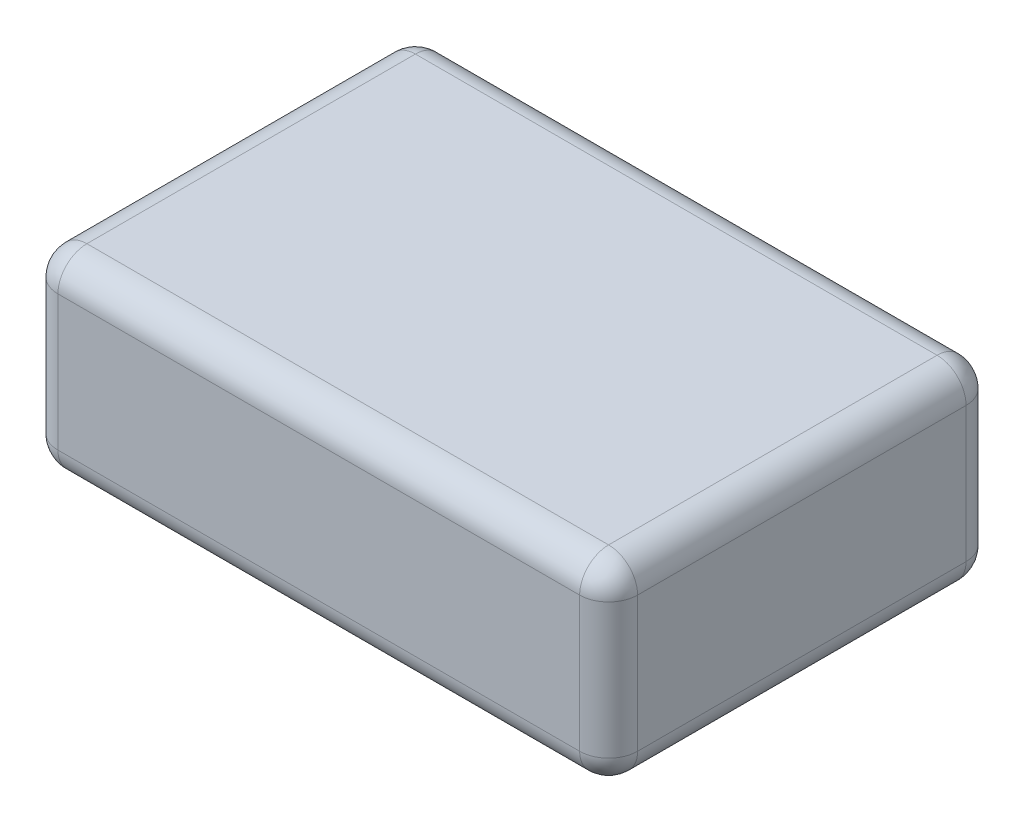
ISO-10303-21;
HEADER;
FILE_DESCRIPTION(('STEP AP214'),'2;1');
FILE_NAME('part.step','',(''),(''),'','','');
FILE_SCHEMA(('AUTOMOTIVE_DESIGN { 1 0 10303 214 1 1 1 1 }'));
ENDSEC;
DATA;
#1=APPLICATION_CONTEXT('core data for automotive mechanical design processes');
#2=APPLICATION_PROTOCOL_DEFINITION('international standard','automotive_design',2000,#1);
#3=PRODUCT_CONTEXT('',#1,'mechanical');
#4=PRODUCT('Part','Part','',(#3));
#5=PRODUCT_RELATED_PRODUCT_CATEGORY('part','',(#4));
#6=PRODUCT_DEFINITION_FORMATION('','',#4);
#7=PRODUCT_DEFINITION_CONTEXT('part definition',#1,'design');
#8=PRODUCT_DEFINITION('design','',#6,#7);
#9=PRODUCT_DEFINITION_SHAPE('','',#8);
#10=(LENGTH_UNIT() NAMED_UNIT(*) SI_UNIT(.MILLI.,.METRE.));
#11=(NAMED_UNIT(*) PLANE_ANGLE_UNIT() SI_UNIT($,.RADIAN.));
#12=(NAMED_UNIT(*) SI_UNIT($,.STERADIAN.) SOLID_ANGLE_UNIT());
#13=UNCERTAINTY_MEASURE_WITH_UNIT(LENGTH_MEASURE(1.E-05),#10,'distance_accuracy_value','');
#14=(GEOMETRIC_REPRESENTATION_CONTEXT(3) GLOBAL_UNCERTAINTY_ASSIGNED_CONTEXT((#13)) GLOBAL_UNIT_ASSIGNED_CONTEXT((#10,
#11,#12)) REPRESENTATION_CONTEXT('',''));
#15=CARTESIAN_POINT('',(0.,0.,0.));
#16=DIRECTION('',(0.,0.,1.));
#17=DIRECTION('',(1.,0.,0.));
#18=AXIS2_PLACEMENT_3D('',#15,#16,#17);
#19=CARTESIAN_POINT('',(-150.,-50.,100.));
#20=DIRECTION('',(-1.,0.,0.));
#21=DIRECTION('',(0.,0.,1.));
#22=AXIS2_PLACEMENT_3D('',#19,#20,#21);
#23=PLANE('',#22);
#24=DIRECTION('',(0.,0.,-1.));
#25=VECTOR('',#24,1.);
#26=CARTESIAN_POINT('',(-150.,35.,100.));
#27=LINE('',#26,#25);
#28=CARTESIAN_POINT('',(-150.,35.,85.));
#29=VERTEX_POINT('',#28);
#30=CARTESIAN_POINT('',(-150.,35.,-85.));
#31=VERTEX_POINT('',#30);
#32=EDGE_CURVE('E166',#29,#31,#27,.T.);
#33=ORIENTED_EDGE('',*,*,#32,.T.);
#34=DIRECTION('',(0.,1.,0.));
#35=VECTOR('',#34,1.);
#36=CARTESIAN_POINT('',(-150.,-50.,-85.));
#37=LINE('',#36,#35);
#38=CARTESIAN_POINT('',(-150.,-35.,-85.));
#39=VERTEX_POINT('',#38);
#40=EDGE_CURVE('E135',#31,#39,#37,.F.);
#41=ORIENTED_EDGE('',*,*,#40,.T.);
#42=DIRECTION('',(0.,0.,-1.));
#43=VECTOR('',#42,1.);
#44=CARTESIAN_POINT('',(-150.,-35.,100.));
#45=LINE('',#44,#43);
#46=CARTESIAN_POINT('',(-150.,-35.,85.));
#47=VERTEX_POINT('',#46);
#48=EDGE_CURVE('E177',#39,#47,#45,.F.);
#49=ORIENTED_EDGE('',*,*,#48,.T.);
#50=DIRECTION('',(0.,1.,0.));
#51=VECTOR('',#50,1.);
#52=CARTESIAN_POINT('',(-150.,50.,85.));
#53=LINE('',#52,#51);
#54=EDGE_CURVE('E170',#47,#29,#53,.T.);
#55=ORIENTED_EDGE('',*,*,#54,.T.);
#56=EDGE_LOOP('',(#33,#41,#49,#55));
#57=FACE_BOUND('',#56,.T.);
#58=ADVANCED_FACE('F39',(#57),#23,.T.);
#59=CARTESIAN_POINT('',(-150.,-50.,100.));
#60=DIRECTION('',(0.,1.,0.));
#61=DIRECTION('',(0.,0.,1.));
#62=AXIS2_PLACEMENT_3D('',#59,#60,#61);
#63=PLANE('',#62);
#64=DIRECTION('',(1.,0.,0.));
#65=VECTOR('',#64,1.);
#66=CARTESIAN_POINT('',(-150.,-50.,85.));
#67=LINE('',#66,#65);
#68=CARTESIAN_POINT('',(135.,-50.,85.));
#69=VERTEX_POINT('',#68);
#70=CARTESIAN_POINT('',(-135.,-50.,85.));
#71=VERTEX_POINT('',#70);
#72=EDGE_CURVE('E182',#69,#71,#67,.F.);
#73=ORIENTED_EDGE('',*,*,#72,.T.);
#74=DIRECTION('',(0.,0.,-1.));
#75=VECTOR('',#74,1.);
#76=CARTESIAN_POINT('',(-135.,-50.,-100.));
#77=LINE('',#76,#75);
#78=CARTESIAN_POINT('',(-135.,-50.,-85.));
#79=VERTEX_POINT('',#78);
#80=EDGE_CURVE('E191',#71,#79,#77,.T.);
#81=ORIENTED_EDGE('',*,*,#80,.T.);
#82=DIRECTION('',(1.,0.,0.));
#83=VECTOR('',#82,1.);
#84=CARTESIAN_POINT('',(150.,-50.,-85.));
#85=LINE('',#84,#83);
#86=CARTESIAN_POINT('',(135.,-50.,-85.));
#87=VERTEX_POINT('',#86);
#88=EDGE_CURVE('E188',#79,#87,#85,.T.);
#89=ORIENTED_EDGE('',*,*,#88,.T.);
#90=DIRECTION('',(0.,0.,-1.));
#91=VECTOR('',#90,1.);
#92=CARTESIAN_POINT('',(135.,-50.,100.));
#93=LINE('',#92,#91);
#94=EDGE_CURVE('E185',#87,#69,#93,.F.);
#95=ORIENTED_EDGE('',*,*,#94,.T.);
#96=EDGE_LOOP('',(#73,#81,#89,#95));
#97=FACE_BOUND('',#96,.T.);
#98=ADVANCED_FACE('F323',(#97),#63,.F.);
#99=CARTESIAN_POINT('',(150.,-50.,100.));
#100=DIRECTION('',(-1.,0.,0.));
#101=DIRECTION('',(0.,0.,1.));
#102=AXIS2_PLACEMENT_3D('',#99,#100,#101);
#103=PLANE('',#102);
#104=DIRECTION('',(0.,1.,0.));
#105=VECTOR('',#104,1.);
#106=CARTESIAN_POINT('',(150.,-50.,85.));
#107=LINE('',#106,#105);
#108=CARTESIAN_POINT('',(150.,35.,85.));
#109=VERTEX_POINT('',#108);
#110=CARTESIAN_POINT('',(150.,-35.,85.));
#111=VERTEX_POINT('',#110);
#112=EDGE_CURVE('E198',#109,#111,#107,.F.);
#113=ORIENTED_EDGE('',*,*,#112,.T.);
#114=DIRECTION('',(0.,0.,-1.));
#115=VECTOR('',#114,1.);
#116=CARTESIAN_POINT('',(150.,-35.,100.));
#117=LINE('',#116,#115);
#118=CARTESIAN_POINT('',(150.,-35.,-85.));
#119=VERTEX_POINT('',#118);
#120=EDGE_CURVE('E204',#111,#119,#117,.T.);
#121=ORIENTED_EDGE('',*,*,#120,.T.);
#122=DIRECTION('',(0.,1.,0.));
#123=VECTOR('',#122,1.);
#124=CARTESIAN_POINT('',(150.,50.,-85.));
#125=LINE('',#124,#123);
#126=CARTESIAN_POINT('',(150.,35.,-85.));
#127=VERTEX_POINT('',#126);
#128=EDGE_CURVE('E201',#119,#127,#125,.T.);
#129=ORIENTED_EDGE('',*,*,#128,.T.);
#130=DIRECTION('',(0.,0.,-1.));
#131=VECTOR('',#130,1.);
#132=CARTESIAN_POINT('',(150.,35.,100.));
#133=LINE('',#132,#131);
#134=EDGE_CURVE('E195',#127,#109,#133,.F.);
#135=ORIENTED_EDGE('',*,*,#134,.T.);
#136=EDGE_LOOP('',(#113,#121,#129,#135));
#137=FACE_BOUND('',#136,.T.);
#138=ADVANCED_FACE('F332',(#137),#103,.F.);
#139=CARTESIAN_POINT('',(-150.,50.,100.));
#140=DIRECTION('',(0.,1.,0.));
#141=DIRECTION('',(0.,0.,1.));
#142=AXIS2_PLACEMENT_3D('',#139,#140,#141);
#143=PLANE('',#142);
#144=DIRECTION('',(1.,0.,0.));
#145=VECTOR('',#144,1.);
#146=CARTESIAN_POINT('',(150.,50.,85.));
#147=LINE('',#146,#145);
#148=CARTESIAN_POINT('',(-135.,50.,85.));
#149=VERTEX_POINT('',#148);
#150=CARTESIAN_POINT('',(135.,50.,85.));
#151=VERTEX_POINT('',#150);
#152=EDGE_CURVE('E49',#149,#151,#147,.T.);
#153=ORIENTED_EDGE('',*,*,#152,.T.);
#154=DIRECTION('',(0.,0.,-1.));
#155=VECTOR('',#154,1.);
#156=CARTESIAN_POINT('',(135.,50.,-100.));
#157=LINE('',#156,#155);
#158=CARTESIAN_POINT('',(135.,50.,-85.));
#159=VERTEX_POINT('',#158);
#160=EDGE_CURVE('E11',#151,#159,#157,.T.);
#161=ORIENTED_EDGE('',*,*,#160,.T.);
#162=DIRECTION('',(1.,0.,0.));
#163=VECTOR('',#162,1.);
#164=CARTESIAN_POINT('',(-150.,50.,-85.));
#165=LINE('',#164,#163);
#166=CARTESIAN_POINT('',(-135.,50.,-85.));
#167=VERTEX_POINT('',#166);
#168=EDGE_CURVE('E221',#159,#167,#165,.F.);
#169=ORIENTED_EDGE('',*,*,#168,.T.);
#170=DIRECTION('',(0.,0.,-1.));
#171=VECTOR('',#170,1.);
#172=CARTESIAN_POINT('',(-135.,50.,100.));
#173=LINE('',#172,#171);
#174=EDGE_CURVE('E60',#167,#149,#173,.F.);
#175=ORIENTED_EDGE('',*,*,#174,.T.);
#176=EDGE_LOOP('',(#153,#161,#169,#175));
#177=FACE_BOUND('',#176,.T.);
#178=ADVANCED_FACE('F374',(#177),#143,.T.);
#179=CARTESIAN_POINT('',(0.,0.,100.));
#180=DIRECTION('',(0.,0.,-1.));
#181=DIRECTION('',(-1.,0.,0.));
#182=AXIS2_PLACEMENT_3D('',#179,#180,#181);
#183=PLANE('',#182);
#184=DIRECTION('',(1.,0.,0.));
#185=VECTOR('',#184,1.);
#186=CARTESIAN_POINT('',(0.,-35.,100.));
#187=LINE('',#186,#185);
#188=CARTESIAN_POINT('',(-135.,-35.,100.));
#189=VERTEX_POINT('',#188);
#190=CARTESIAN_POINT('',(135.,-35.,100.));
#191=VERTEX_POINT('',#190);
#192=EDGE_CURVE('E214',#189,#191,#187,.T.);
#193=ORIENTED_EDGE('',*,*,#192,.T.);
#194=DIRECTION('',(0.,1.,0.));
#195=VECTOR('',#194,1.);
#196=CARTESIAN_POINT('',(135.,0.,100.));
#197=LINE('',#196,#195);
#198=CARTESIAN_POINT('',(135.,35.,100.));
#199=VERTEX_POINT('',#198);
#200=EDGE_CURVE('E217',#191,#199,#197,.T.);
#201=ORIENTED_EDGE('',*,*,#200,.T.);
#202=DIRECTION('',(1.,0.,0.));
#203=VECTOR('',#202,1.);
#204=CARTESIAN_POINT('',(-150.,35.,100.));
#205=LINE('',#204,#203);
#206=CARTESIAN_POINT('',(-135.,35.,100.));
#207=VERTEX_POINT('',#206);
#208=EDGE_CURVE('E208',#199,#207,#205,.F.);
#209=ORIENTED_EDGE('',*,*,#208,.T.);
#210=DIRECTION('',(0.,1.,0.));
#211=VECTOR('',#210,1.);
#212=CARTESIAN_POINT('',(-135.,-50.,100.));
#213=LINE('',#212,#211);
#214=EDGE_CURVE('E211',#207,#189,#213,.F.);
#215=ORIENTED_EDGE('',*,*,#214,.T.);
#216=EDGE_LOOP('',(#193,#201,#209,#215));
#217=FACE_BOUND('',#216,.T.);
#218=ADVANCED_FACE('F335',(#217),#183,.F.);
#219=CARTESIAN_POINT('',(0.,0.,-100.));
#220=DIRECTION('',(0.,0.,-1.));
#221=DIRECTION('',(-1.,0.,0.));
#222=AXIS2_PLACEMENT_3D('',#219,#220,#221);
#223=PLANE('',#222);
#224=DIRECTION('',(1.,0.,0.));
#225=VECTOR('',#224,1.);
#226=CARTESIAN_POINT('',(-150.,-35.,-100.));
#227=LINE('',#226,#225);
#228=CARTESIAN_POINT('',(135.,-35.,-100.));
#229=VERTEX_POINT('',#228);
#230=CARTESIAN_POINT('',(-135.,-35.,-100.));
#231=VERTEX_POINT('',#230);
#232=EDGE_CURVE('E163',#229,#231,#227,.F.);
#233=ORIENTED_EDGE('',*,*,#232,.T.);
#234=DIRECTION('',(0.,1.,0.));
#235=VECTOR('',#234,1.);
#236=CARTESIAN_POINT('',(-135.,0.,-100.));
#237=LINE('',#236,#235);
#238=CARTESIAN_POINT('',(-135.,35.,-100.));
#239=VERTEX_POINT('',#238);
#240=EDGE_CURVE('E133',#231,#239,#237,.T.);
#241=ORIENTED_EDGE('',*,*,#240,.T.);
#242=DIRECTION('',(1.,0.,0.));
#243=VECTOR('',#242,1.);
#244=CARTESIAN_POINT('',(0.,35.,-100.));
#245=LINE('',#244,#243);
#246=CARTESIAN_POINT('',(135.,35.,-100.));
#247=VERTEX_POINT('',#246);
#248=EDGE_CURVE('E152',#239,#247,#245,.T.);
#249=ORIENTED_EDGE('',*,*,#248,.T.);
#250=DIRECTION('',(0.,1.,0.));
#251=VECTOR('',#250,1.);
#252=CARTESIAN_POINT('',(135.,-50.,-100.));
#253=LINE('',#252,#251);
#254=EDGE_CURVE('E159',#247,#229,#253,.F.);
#255=ORIENTED_EDGE('',*,*,#254,.T.);
#256=EDGE_LOOP('',(#233,#241,#249,#255));
#257=FACE_BOUND('',#256,.T.);
#258=ADVANCED_FACE('F161',(#257),#223,.T.);
#259=CARTESIAN_POINT('',(135.,0.,85.));
#260=DIRECTION('',(0.,1.,0.));
#261=DIRECTION('',(0.,0.,1.));
#262=AXIS2_PLACEMENT_3D('',#259,#260,#261);
#263=CYLINDRICAL_SURFACE('',#262,15.);
#264=CARTESIAN_POINT('',(135.,-35.,85.));
#265=DIRECTION('',(0.,-1.,0.));
#266=DIRECTION('',(0.,0.,-1.));
#267=AXIS2_PLACEMENT_3D('',#264,#265,#266);
#268=CIRCLE('',#267,15.);
#269=EDGE_CURVE('E43',#111,#191,#268,.T.);
#270=ORIENTED_EDGE('',*,*,#269,.F.);
#271=ORIENTED_EDGE('',*,*,#112,.F.);
#272=CARTESIAN_POINT('',(135.,35.,85.));
#273=DIRECTION('',(0.,1.,0.));
#274=DIRECTION('',(0.,0.,1.));
#275=AXIS2_PLACEMENT_3D('',#272,#273,#274);
#276=CIRCLE('',#275,15.);
#277=EDGE_CURVE('E297',#199,#109,#276,.T.);
#278=ORIENTED_EDGE('',*,*,#277,.F.);
#279=ORIENTED_EDGE('',*,*,#200,.F.);
#280=EDGE_LOOP('',(#270,#271,#278,#279));
#281=FACE_BOUND('',#280,.T.);
#282=ADVANCED_FACE('F41',(#281),#263,.T.);
#283=CARTESIAN_POINT('',(135.,-35.,85.));
#284=DIRECTION('',(0.,0.,1.));
#285=DIRECTION('',(1.,0.,0.));
#286=AXIS2_PLACEMENT_3D('',#283,#284,#285);
#287=SPHERICAL_SURFACE('',#286,15.);
#288=CARTESIAN_POINT('',(135.,-35.,85.));
#289=DIRECTION('',(0.,0.,1.));
#290=DIRECTION('',(1.,0.,0.));
#291=AXIS2_PLACEMENT_3D('',#288,#289,#290);
#292=CIRCLE('',#291,15.);
#293=EDGE_CURVE('E290',#111,#69,#292,.F.);
#294=ORIENTED_EDGE('',*,*,#293,.F.);
#295=ORIENTED_EDGE('',*,*,#269,.T.);
#296=CARTESIAN_POINT('',(135.,-35.,85.));
#297=DIRECTION('',(1.,0.,0.));
#298=DIRECTION('',(0.,0.,-1.));
#299=AXIS2_PLACEMENT_3D('',#296,#297,#298);
#300=CIRCLE('',#299,15.);
#301=EDGE_CURVE('E294',#69,#191,#300,.F.);
#302=ORIENTED_EDGE('',*,*,#301,.F.);
#303=EDGE_LOOP('',(#294,#295,#302));
#304=FACE_BOUND('',#303,.T.);
#305=ADVANCED_FACE('F310',(#304),#287,.T.);
#306=CARTESIAN_POINT('',(135.,35.,85.));
#307=DIRECTION('',(0.,0.,1.));
#308=DIRECTION('',(1.,0.,0.));
#309=AXIS2_PLACEMENT_3D('',#306,#307,#308);
#310=SPHERICAL_SURFACE('',#309,15.);
#311=CARTESIAN_POINT('',(135.,35.,85.));
#312=DIRECTION('',(1.,0.,0.));
#313=DIRECTION('',(0.,0.,-1.));
#314=AXIS2_PLACEMENT_3D('',#311,#312,#313);
#315=CIRCLE('',#314,15.);
#316=EDGE_CURVE('E283',#199,#151,#315,.F.);
#317=ORIENTED_EDGE('',*,*,#316,.F.);
#318=ORIENTED_EDGE('',*,*,#277,.T.);
#319=CARTESIAN_POINT('',(135.,35.,85.));
#320=DIRECTION('',(0.,0.,1.));
#321=DIRECTION('',(1.,0.,0.));
#322=AXIS2_PLACEMENT_3D('',#319,#320,#321);
#323=CIRCLE('',#322,15.);
#324=EDGE_CURVE('E286',#151,#109,#323,.F.);
#325=ORIENTED_EDGE('',*,*,#324,.F.);
#326=EDGE_LOOP('',(#317,#318,#325));
#327=FACE_BOUND('',#326,.T.);
#328=ADVANCED_FACE('F425',(#327),#310,.T.);
#329=CARTESIAN_POINT('',(0.,-35.,85.));
#330=DIRECTION('',(1.,0.,0.));
#331=DIRECTION('',(0.,0.,-1.));
#332=AXIS2_PLACEMENT_3D('',#329,#330,#331);
#333=CYLINDRICAL_SURFACE('',#332,15.);
#334=ORIENTED_EDGE('',*,*,#301,.T.);
#335=ORIENTED_EDGE('',*,*,#192,.F.);
#336=CARTESIAN_POINT('',(-135.,-35.,85.));
#337=DIRECTION('',(-1.,0.,0.));
#338=DIRECTION('',(0.,0.,1.));
#339=AXIS2_PLACEMENT_3D('',#336,#337,#338);
#340=CIRCLE('',#339,15.);
#341=EDGE_CURVE('E275',#71,#189,#340,.T.);
#342=ORIENTED_EDGE('',*,*,#341,.F.);
#343=ORIENTED_EDGE('',*,*,#72,.F.);
#344=EDGE_LOOP('',(#334,#335,#342,#343));
#345=FACE_BOUND('',#344,.T.);
#346=ADVANCED_FACE('F318',(#345),#333,.T.);
#347=CARTESIAN_POINT('',(135.,-35.,100.));
#348=DIRECTION('',(0.,0.,-1.));
#349=DIRECTION('',(-1.,0.,0.));
#350=AXIS2_PLACEMENT_3D('',#347,#348,#349);
#351=CYLINDRICAL_SURFACE('',#350,15.);
#352=ORIENTED_EDGE('',*,*,#293,.T.);
#353=ORIENTED_EDGE('',*,*,#94,.F.);
#354=CARTESIAN_POINT('',(135.,-35.,-85.));
#355=DIRECTION('',(0.,0.,-1.));
#356=DIRECTION('',(-1.,0.,0.));
#357=AXIS2_PLACEMENT_3D('',#354,#355,#356);
#358=CIRCLE('',#357,15.);
#359=EDGE_CURVE('E271',#119,#87,#358,.T.);
#360=ORIENTED_EDGE('',*,*,#359,.F.);
#361=ORIENTED_EDGE('',*,*,#120,.F.);
#362=EDGE_LOOP('',(#352,#353,#360,#361));
#363=FACE_BOUND('',#362,.T.);
#364=ADVANCED_FACE('F329',(#363),#351,.T.);
#365=CARTESIAN_POINT('',(135.,-50.,-85.));
#366=DIRECTION('',(0.,-1.,0.));
#367=DIRECTION('',(0.,0.,-1.));
#368=AXIS2_PLACEMENT_3D('',#365,#366,#367);
#369=CYLINDRICAL_SURFACE('',#368,15.);
#370=CARTESIAN_POINT('',(135.,35.,-85.));
#371=DIRECTION('',(0.,1.,0.));
#372=DIRECTION('',(0.,0.,1.));
#373=AXIS2_PLACEMENT_3D('',#370,#371,#372);
#374=CIRCLE('',#373,15.);
#375=EDGE_CURVE('E264',#127,#247,#374,.T.);
#376=ORIENTED_EDGE('',*,*,#375,.F.);
#377=ORIENTED_EDGE('',*,*,#128,.F.);
#378=CARTESIAN_POINT('',(135.,-35.,-85.));
#379=DIRECTION('',(0.,-1.,0.));
#380=DIRECTION('',(0.,0.,-1.));
#381=AXIS2_PLACEMENT_3D('',#378,#379,#380);
#382=CIRCLE('',#381,15.);
#383=EDGE_CURVE('E268',#229,#119,#382,.T.);
#384=ORIENTED_EDGE('',*,*,#383,.F.);
#385=ORIENTED_EDGE('',*,*,#254,.F.);
#386=EDGE_LOOP('',(#376,#377,#384,#385));
#387=FACE_BOUND('',#386,.T.);
#388=ADVANCED_FACE('F367',(#387),#369,.T.);
#389=CARTESIAN_POINT('',(135.,35.,100.));
#390=DIRECTION('',(0.,0.,1.));
#391=DIRECTION('',(1.,0.,0.));
#392=AXIS2_PLACEMENT_3D('',#389,#390,#391);
#393=CYLINDRICAL_SURFACE('',#392,15.);
#394=ORIENTED_EDGE('',*,*,#324,.T.);
#395=ORIENTED_EDGE('',*,*,#134,.F.);
#396=CARTESIAN_POINT('',(135.,35.,-85.));
#397=DIRECTION('',(0.,0.,-1.));
#398=DIRECTION('',(-1.,0.,0.));
#399=AXIS2_PLACEMENT_3D('',#396,#397,#398);
#400=CIRCLE('',#399,15.);
#401=EDGE_CURVE('E260',#159,#127,#400,.T.);
#402=ORIENTED_EDGE('',*,*,#401,.F.);
#403=ORIENTED_EDGE('',*,*,#160,.F.);
#404=EDGE_LOOP('',(#394,#395,#402,#403));
#405=FACE_BOUND('',#404,.T.);
#406=ADVANCED_FACE('F373',(#405),#393,.T.);
#407=CARTESIAN_POINT('',(-150.,35.,85.));
#408=DIRECTION('',(-1.,0.,0.));
#409=DIRECTION('',(0.,0.,1.));
#410=AXIS2_PLACEMENT_3D('',#407,#408,#409);
#411=CYLINDRICAL_SURFACE('',#410,15.);
#412=ORIENTED_EDGE('',*,*,#316,.T.);
#413=ORIENTED_EDGE('',*,*,#152,.F.);
#414=CARTESIAN_POINT('',(-135.,35.,85.));
#415=DIRECTION('',(-1.,0.,0.));
#416=DIRECTION('',(0.,0.,1.));
#417=AXIS2_PLACEMENT_3D('',#414,#415,#416);
#418=CIRCLE('',#417,15.);
#419=EDGE_CURVE('E256',#207,#149,#418,.T.);
#420=ORIENTED_EDGE('',*,*,#419,.F.);
#421=ORIENTED_EDGE('',*,*,#208,.F.);
#422=EDGE_LOOP('',(#412,#413,#420,#421));
#423=FACE_BOUND('',#422,.T.);
#424=ADVANCED_FACE('F344',(#423),#411,.T.);
#425=CARTESIAN_POINT('',(-135.,-50.,85.));
#426=DIRECTION('',(0.,-1.,0.));
#427=DIRECTION('',(0.,0.,-1.));
#428=AXIS2_PLACEMENT_3D('',#425,#426,#427);
#429=CYLINDRICAL_SURFACE('',#428,15.);
#430=CARTESIAN_POINT('',(-135.,-35.,85.));
#431=DIRECTION('',(0.,-1.,0.));
#432=DIRECTION('',(0.,0.,-1.));
#433=AXIS2_PLACEMENT_3D('',#430,#431,#432);
#434=CIRCLE('',#433,15.);
#435=EDGE_CURVE('E279',#189,#47,#434,.T.);
#436=ORIENTED_EDGE('',*,*,#435,.F.);
#437=ORIENTED_EDGE('',*,*,#214,.F.);
#438=CARTESIAN_POINT('',(-135.,35.,85.));
#439=DIRECTION('',(0.,1.,0.));
#440=DIRECTION('',(0.,0.,1.));
#441=AXIS2_PLACEMENT_3D('',#438,#439,#440);
#442=CIRCLE('',#441,15.);
#443=EDGE_CURVE('E252',#29,#207,#442,.T.);
#444=ORIENTED_EDGE('',*,*,#443,.F.);
#445=ORIENTED_EDGE('',*,*,#54,.F.);
#446=EDGE_LOOP('',(#436,#437,#444,#445));
#447=FACE_BOUND('',#446,.T.);
#448=ADVANCED_FACE('F340',(#447),#429,.T.);
#449=CARTESIAN_POINT('',(-135.,-35.,85.));
#450=DIRECTION('',(0.,0.,1.));
#451=DIRECTION('',(1.,0.,0.));
#452=AXIS2_PLACEMENT_3D('',#449,#450,#451);
#453=SPHERICAL_SURFACE('',#452,15.);
#454=ORIENTED_EDGE('',*,*,#341,.T.);
#455=ORIENTED_EDGE('',*,*,#435,.T.);
#456=CARTESIAN_POINT('',(-135.,-35.,85.));
#457=DIRECTION('',(0.,0.,1.));
#458=DIRECTION('',(1.,0.,0.));
#459=AXIS2_PLACEMENT_3D('',#456,#457,#458);
#460=CIRCLE('',#459,15.);
#461=EDGE_CURVE('E248',#71,#47,#460,.F.);
#462=ORIENTED_EDGE('',*,*,#461,.F.);
#463=EDGE_LOOP('',(#454,#455,#462));
#464=FACE_BOUND('',#463,.T.);
#465=ADVANCED_FACE('F353',(#464),#453,.T.);
#466=CARTESIAN_POINT('',(135.,-35.,-85.));
#467=DIRECTION('',(0.,0.,1.));
#468=DIRECTION('',(1.,0.,0.));
#469=AXIS2_PLACEMENT_3D('',#466,#467,#468);
#470=SPHERICAL_SURFACE('',#469,15.);
#471=ORIENTED_EDGE('',*,*,#383,.T.);
#472=ORIENTED_EDGE('',*,*,#359,.T.);
#473=CARTESIAN_POINT('',(135.,-35.,-85.));
#474=DIRECTION('',(1.,0.,0.));
#475=DIRECTION('',(0.,0.,-1.));
#476=AXIS2_PLACEMENT_3D('',#473,#474,#475);
#477=CIRCLE('',#476,15.);
#478=EDGE_CURVE('E244',#229,#87,#477,.F.);
#479=ORIENTED_EDGE('',*,*,#478,.F.);
#480=EDGE_LOOP('',(#471,#472,#479));
#481=FACE_BOUND('',#480,.T.);
#482=ADVANCED_FACE('F363',(#481),#470,.T.);
#483=CARTESIAN_POINT('',(135.,35.,-85.));
#484=DIRECTION('',(0.,0.,1.));
#485=DIRECTION('',(1.,0.,0.));
#486=AXIS2_PLACEMENT_3D('',#483,#484,#485);
#487=SPHERICAL_SURFACE('',#486,15.);
#488=ORIENTED_EDGE('',*,*,#401,.T.);
#489=ORIENTED_EDGE('',*,*,#375,.T.);
#490=CARTESIAN_POINT('',(135.,35.,-85.));
#491=DIRECTION('',(1.,0.,0.));
#492=DIRECTION('',(0.,1.,0.));
#493=AXIS2_PLACEMENT_3D('',#490,#491,#492);
#494=CIRCLE('',#493,15.);
#495=EDGE_CURVE('E155',#159,#247,#494,.F.);
#496=ORIENTED_EDGE('',*,*,#495,.F.);
#497=EDGE_LOOP('',(#488,#489,#496));
#498=FACE_BOUND('',#497,.T.);
#499=ADVANCED_FACE('F370',(#498),#487,.T.);
#500=CARTESIAN_POINT('',(-135.,35.,85.));
#501=DIRECTION('',(0.,0.,1.));
#502=DIRECTION('',(1.,0.,0.));
#503=AXIS2_PLACEMENT_3D('',#500,#501,#502);
#504=SPHERICAL_SURFACE('',#503,15.);
#505=ORIENTED_EDGE('',*,*,#443,.T.);
#506=ORIENTED_EDGE('',*,*,#419,.T.);
#507=CARTESIAN_POINT('',(-135.,35.,85.));
#508=DIRECTION('',(0.,0.,1.));
#509=DIRECTION('',(1.,0.,0.));
#510=AXIS2_PLACEMENT_3D('',#507,#508,#509);
#511=CIRCLE('',#510,15.);
#512=EDGE_CURVE('E238',#29,#149,#511,.F.);
#513=ORIENTED_EDGE('',*,*,#512,.F.);
#514=EDGE_LOOP('',(#505,#506,#513));
#515=FACE_BOUND('',#514,.T.);
#516=ADVANCED_FACE('F346',(#515),#504,.T.);
#517=CARTESIAN_POINT('',(-135.,-35.,100.));
#518=DIRECTION('',(0.,0.,1.));
#519=DIRECTION('',(1.,0.,0.));
#520=AXIS2_PLACEMENT_3D('',#517,#518,#519);
#521=CYLINDRICAL_SURFACE('',#520,15.);
#522=ORIENTED_EDGE('',*,*,#461,.T.);
#523=ORIENTED_EDGE('',*,*,#48,.F.);
#524=CARTESIAN_POINT('',(-135.,-35.,-85.));
#525=DIRECTION('',(0.,0.,-1.));
#526=DIRECTION('',(-1.,0.,0.));
#527=AXIS2_PLACEMENT_3D('',#524,#525,#526);
#528=CIRCLE('',#527,15.);
#529=EDGE_CURVE('E234',#79,#39,#528,.T.);
#530=ORIENTED_EDGE('',*,*,#529,.F.);
#531=ORIENTED_EDGE('',*,*,#80,.F.);
#532=EDGE_LOOP('',(#522,#523,#530,#531));
#533=FACE_BOUND('',#532,.T.);
#534=ADVANCED_FACE('F355',(#533),#521,.T.);
#535=CARTESIAN_POINT('',(-150.,-35.,-85.));
#536=DIRECTION('',(-1.,0.,0.));
#537=DIRECTION('',(0.,0.,1.));
#538=AXIS2_PLACEMENT_3D('',#535,#536,#537);
#539=CYLINDRICAL_SURFACE('',#538,15.);
#540=ORIENTED_EDGE('',*,*,#478,.T.);
#541=ORIENTED_EDGE('',*,*,#88,.F.);
#542=CARTESIAN_POINT('',(-135.,-35.,-85.));
#543=DIRECTION('',(-1.,0.,0.));
#544=DIRECTION('',(0.,0.,1.));
#545=AXIS2_PLACEMENT_3D('',#542,#543,#544);
#546=CIRCLE('',#545,15.);
#547=EDGE_CURVE('E149',#231,#79,#546,.T.);
#548=ORIENTED_EDGE('',*,*,#547,.F.);
#549=ORIENTED_EDGE('',*,*,#232,.F.);
#550=EDGE_LOOP('',(#540,#541,#548,#549));
#551=FACE_BOUND('',#550,.T.);
#552=ADVANCED_FACE('F360',(#551),#539,.T.);
#553=CARTESIAN_POINT('',(0.,35.,-85.));
#554=DIRECTION('',(1.,0.,0.));
#555=DIRECTION('',(0.,0.,-1.));
#556=AXIS2_PLACEMENT_3D('',#553,#554,#555);
#557=CYLINDRICAL_SURFACE('',#556,15.);
#558=ORIENTED_EDGE('',*,*,#495,.T.);
#559=ORIENTED_EDGE('',*,*,#248,.F.);
#560=CARTESIAN_POINT('',(-135.,35.,-85.));
#561=DIRECTION('',(-1.,0.,0.));
#562=DIRECTION('',(0.,0.,1.));
#563=AXIS2_PLACEMENT_3D('',#560,#561,#562);
#564=CIRCLE('',#563,15.);
#565=EDGE_CURVE('E142',#167,#239,#564,.T.);
#566=ORIENTED_EDGE('',*,*,#565,.F.);
#567=ORIENTED_EDGE('',*,*,#168,.F.);
#568=EDGE_LOOP('',(#558,#559,#566,#567));
#569=FACE_BOUND('',#568,.T.);
#570=ADVANCED_FACE('F153',(#569),#557,.T.);
#571=CARTESIAN_POINT('',(-135.,35.,100.));
#572=DIRECTION('',(0.,0.,-1.));
#573=DIRECTION('',(-1.,0.,0.));
#574=AXIS2_PLACEMENT_3D('',#571,#572,#573);
#575=CYLINDRICAL_SURFACE('',#574,15.);
#576=ORIENTED_EDGE('',*,*,#512,.T.);
#577=ORIENTED_EDGE('',*,*,#174,.F.);
#578=CARTESIAN_POINT('',(-135.,35.,-85.));
#579=DIRECTION('',(0.,0.,-1.));
#580=DIRECTION('',(-1.,0.,0.));
#581=AXIS2_PLACEMENT_3D('',#578,#579,#580);
#582=CIRCLE('',#581,15.);
#583=EDGE_CURVE('E146',#31,#167,#582,.T.);
#584=ORIENTED_EDGE('',*,*,#583,.F.);
#585=ORIENTED_EDGE('',*,*,#32,.F.);
#586=EDGE_LOOP('',(#576,#577,#584,#585));
#587=FACE_BOUND('',#586,.T.);
#588=ADVANCED_FACE('F349',(#587),#575,.T.);
#589=CARTESIAN_POINT('',(-135.,-35.,-85.));
#590=DIRECTION('',(0.,0.,1.));
#591=DIRECTION('',(1.,0.,0.));
#592=AXIS2_PLACEMENT_3D('',#589,#590,#591);
#593=SPHERICAL_SURFACE('',#592,15.);
#594=ORIENTED_EDGE('',*,*,#547,.T.);
#595=ORIENTED_EDGE('',*,*,#529,.T.);
#596=CARTESIAN_POINT('',(-135.,-35.,-85.));
#597=DIRECTION('',(0.,-1.,0.));
#598=DIRECTION('',(0.,0.,-1.));
#599=AXIS2_PLACEMENT_3D('',#596,#597,#598);
#600=CIRCLE('',#599,15.);
#601=EDGE_CURVE('E139',#231,#39,#600,.F.);
#602=ORIENTED_EDGE('',*,*,#601,.F.);
#603=EDGE_LOOP('',(#594,#595,#602));
#604=FACE_BOUND('',#603,.T.);
#605=ADVANCED_FACE('F394',(#604),#593,.T.);
#606=CARTESIAN_POINT('',(-135.,35.,-85.));
#607=DIRECTION('',(0.,0.,1.));
#608=DIRECTION('',(1.,0.,0.));
#609=AXIS2_PLACEMENT_3D('',#606,#607,#608);
#610=SPHERICAL_SURFACE('',#609,15.);
#611=ORIENTED_EDGE('',*,*,#583,.T.);
#612=ORIENTED_EDGE('',*,*,#565,.T.);
#613=CARTESIAN_POINT('',(-135.,35.,-85.));
#614=DIRECTION('',(0.,1.,0.));
#615=DIRECTION('',(0.,0.,1.));
#616=AXIS2_PLACEMENT_3D('',#613,#614,#615);
#617=CIRCLE('',#616,15.);
#618=EDGE_CURVE('E129',#31,#239,#617,.F.);
#619=ORIENTED_EDGE('',*,*,#618,.F.);
#620=EDGE_LOOP('',(#611,#612,#619));
#621=FACE_BOUND('',#620,.T.);
#622=ADVANCED_FACE('F144',(#621),#610,.T.);
#623=CARTESIAN_POINT('',(-135.,0.,-85.));
#624=DIRECTION('',(0.,1.,0.));
#625=DIRECTION('',(0.,0.,1.));
#626=AXIS2_PLACEMENT_3D('',#623,#624,#625);
#627=CYLINDRICAL_SURFACE('',#626,15.);
#628=ORIENTED_EDGE('',*,*,#601,.T.);
#629=ORIENTED_EDGE('',*,*,#40,.F.);
#630=ORIENTED_EDGE('',*,*,#618,.T.);
#631=ORIENTED_EDGE('',*,*,#240,.F.);
#632=EDGE_LOOP('',(#628,#629,#630,#631));
#633=FACE_BOUND('',#632,.T.);
#634=ADVANCED_FACE('F131',(#633),#627,.T.);
#635=CLOSED_SHELL('',(#58,#98,#138,#178,#218,#258,#282,#305,#328,#346,#364,#388,#406,#424,#448,
#465,#482,#499,#516,#534,#552,#570,#588,#605,#622,#634));
#636=MANIFOLD_SOLID_BREP('B2',#635);
#637=ADVANCED_BREP_SHAPE_REPRESENTATION('',(#18,#636),#14);
#638=SHAPE_DEFINITION_REPRESENTATION(#9,#637);
ENDSEC;
END-ISO-10303-21;
